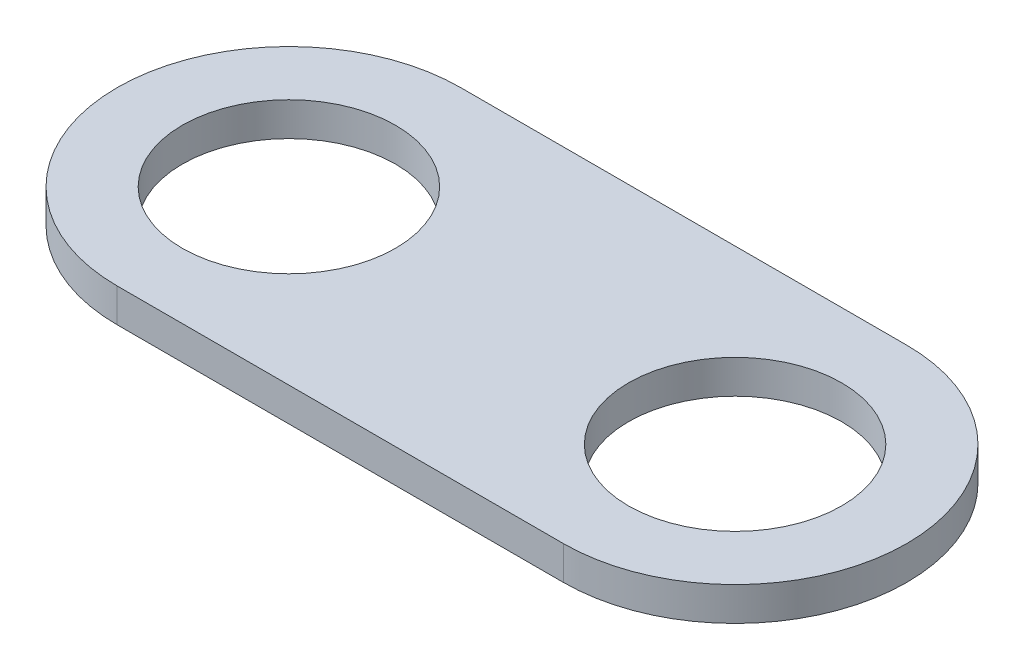
ISO-10303-21;
HEADER;
FILE_DESCRIPTION(('STEP AP214'),'2;1');
FILE_NAME('part.step','',(''),(''),'','','');
FILE_SCHEMA(('AUTOMOTIVE_DESIGN { 1 0 10303 214 1 1 1 1 }'));
ENDSEC;
DATA;
#1=APPLICATION_CONTEXT('core data for automotive mechanical design processes');
#2=APPLICATION_PROTOCOL_DEFINITION('international standard','automotive_design',2000,#1);
#3=PRODUCT_CONTEXT('',#1,'mechanical');
#4=PRODUCT('Part','Part','',(#3));
#5=PRODUCT_RELATED_PRODUCT_CATEGORY('part','',(#4));
#6=PRODUCT_DEFINITION_FORMATION('','',#4);
#7=PRODUCT_DEFINITION_CONTEXT('part definition',#1,'design');
#8=PRODUCT_DEFINITION('design','',#6,#7);
#9=PRODUCT_DEFINITION_SHAPE('','',#8);
#10=(LENGTH_UNIT() NAMED_UNIT(*) SI_UNIT(.MILLI.,.METRE.));
#11=(NAMED_UNIT(*) PLANE_ANGLE_UNIT() SI_UNIT($,.RADIAN.));
#12=(NAMED_UNIT(*) SI_UNIT($,.STERADIAN.) SOLID_ANGLE_UNIT());
#13=UNCERTAINTY_MEASURE_WITH_UNIT(LENGTH_MEASURE(1.E-05),#10,'distance_accuracy_value','');
#14=(GEOMETRIC_REPRESENTATION_CONTEXT(3) GLOBAL_UNCERTAINTY_ASSIGNED_CONTEXT((#13)) GLOBAL_UNIT_ASSIGNED_CONTEXT((#10,
#11,#12)) REPRESENTATION_CONTEXT('',''));
#15=CARTESIAN_POINT('',(0.,0.,0.));
#16=DIRECTION('',(0.,0.,1.));
#17=DIRECTION('',(1.,0.,0.));
#18=AXIS2_PLACEMENT_3D('',#15,#16,#17);
#19=CARTESIAN_POINT('',(-19.879152095,3.,15.30530954));
#20=DIRECTION('',(0.,-1.,0.));
#21=DIRECTION('',(0.,0.,-1.));
#22=AXIS2_PLACEMENT_3D('',#19,#20,#21);
#23=CYLINDRICAL_SURFACE('',#22,15.30530954);
#24=CARTESIAN_POINT('',(-19.879152095,0.,15.30530954));
#25=DIRECTION('',(0.,1.,0.));
#26=DIRECTION('',(0.,0.,1.));
#27=AXIS2_PLACEMENT_3D('',#24,#25,#26);
#28=CIRCLE('',#27,15.30530954);
#29=CARTESIAN_POINT('',(-19.879152095,0.,0.));
#30=VERTEX_POINT('',#29);
#31=CARTESIAN_POINT('',(-19.879152095,0.,30.61061908));
#32=VERTEX_POINT('',#31);
#33=EDGE_CURVE('E107',#30,#32,#28,.T.);
#34=ORIENTED_EDGE('',*,*,#33,.T.);
#35=DIRECTION('',(0.,-1.,0.));
#36=VECTOR('',#35,1.);
#37=CARTESIAN_POINT('',(-19.879152095,3.,30.61061908));
#38=LINE('',#37,#36);
#39=CARTESIAN_POINT('',(-19.879152095,3.,30.61061908));
#40=VERTEX_POINT('',#39);
#41=EDGE_CURVE('E11',#40,#32,#38,.T.);
#42=ORIENTED_EDGE('',*,*,#41,.F.);
#43=CARTESIAN_POINT('',(-19.879152095,3.,15.30530954));
#44=DIRECTION('',(0.,1.,0.));
#45=DIRECTION('',(0.,0.,1.));
#46=AXIS2_PLACEMENT_3D('',#43,#44,#45);
#47=CIRCLE('',#46,15.30530954);
#48=CARTESIAN_POINT('',(-19.879152095,3.,0.));
#49=VERTEX_POINT('',#48);
#50=EDGE_CURVE('E91',#49,#40,#47,.T.);
#51=ORIENTED_EDGE('',*,*,#50,.F.);
#52=DIRECTION('',(0.,-1.,0.));
#53=VECTOR('',#52,1.);
#54=CARTESIAN_POINT('',(-19.879152095,3.,0.));
#55=LINE('',#54,#53);
#56=EDGE_CURVE('E103',#49,#30,#55,.T.);
#57=ORIENTED_EDGE('',*,*,#56,.T.);
#58=EDGE_LOOP('',(#34,#42,#51,#57));
#59=FACE_BOUND('',#58,.T.);
#60=ADVANCED_FACE('F39',(#59),#23,.T.);
#61=CARTESIAN_POINT('',(-19.879152095,3.,30.61061908));
#62=DIRECTION('',(0.,0.,-1.));
#63=DIRECTION('',(-1.,0.,0.));
#64=AXIS2_PLACEMENT_3D('',#61,#62,#63);
#65=PLANE('',#64);
#66=DIRECTION('',(1.,0.,0.));
#67=VECTOR('',#66,1.);
#68=CARTESIAN_POINT('',(-19.879152095,0.,30.61061908));
#69=LINE('',#68,#67);
#70=CARTESIAN_POINT('',(19.879152095,0.,30.61061908));
#71=VERTEX_POINT('',#70);
#72=EDGE_CURVE('E96',#32,#71,#69,.T.);
#73=ORIENTED_EDGE('',*,*,#72,.T.);
#74=DIRECTION('',(0.,-1.,0.));
#75=VECTOR('',#74,1.);
#76=CARTESIAN_POINT('',(19.879152095,3.,30.61061908));
#77=LINE('',#76,#75);
#78=CARTESIAN_POINT('',(19.879152095,3.,30.61061908));
#79=VERTEX_POINT('',#78);
#80=EDGE_CURVE('E48',#79,#71,#77,.T.);
#81=ORIENTED_EDGE('',*,*,#80,.F.);
#82=DIRECTION('',(1.,0.,0.));
#83=VECTOR('',#82,1.);
#84=CARTESIAN_POINT('',(-19.879152095,3.,30.61061908));
#85=LINE('',#84,#83);
#86=EDGE_CURVE('E86',#40,#79,#85,.T.);
#87=ORIENTED_EDGE('',*,*,#86,.F.);
#88=ORIENTED_EDGE('',*,*,#41,.T.);
#89=EDGE_LOOP('',(#73,#81,#87,#88));
#90=FACE_BOUND('',#89,.T.);
#91=ADVANCED_FACE('F95',(#90),#65,.F.);
#92=CARTESIAN_POINT('',(19.879152095,3.,15.30530954));
#93=DIRECTION('',(0.,-1.,0.));
#94=DIRECTION('',(0.,0.,-1.));
#95=AXIS2_PLACEMENT_3D('',#92,#93,#94);
#96=CYLINDRICAL_SURFACE('',#95,15.30530954);
#97=CARTESIAN_POINT('',(19.879152095,0.,15.30530954));
#98=DIRECTION('',(0.,1.,0.));
#99=DIRECTION('',(0.,0.,1.));
#100=AXIS2_PLACEMENT_3D('',#97,#98,#99);
#101=CIRCLE('',#100,15.30530954);
#102=CARTESIAN_POINT('',(19.879152095,0.,0.));
#103=VERTEX_POINT('',#102);
#104=EDGE_CURVE('E73',#71,#103,#101,.T.);
#105=ORIENTED_EDGE('',*,*,#104,.T.);
#106=DIRECTION('',(0.,-1.,0.));
#107=VECTOR('',#106,1.);
#108=CARTESIAN_POINT('',(19.879152095,3.,0.));
#109=LINE('',#108,#107);
#110=CARTESIAN_POINT('',(19.879152095,3.,0.));
#111=VERTEX_POINT('',#110);
#112=EDGE_CURVE('E98',#111,#103,#109,.T.);
#113=ORIENTED_EDGE('',*,*,#112,.F.);
#114=CARTESIAN_POINT('',(19.879152095,3.,15.30530954));
#115=DIRECTION('',(0.,1.,0.));
#116=DIRECTION('',(0.,0.,1.));
#117=AXIS2_PLACEMENT_3D('',#114,#115,#116);
#118=CIRCLE('',#117,15.30530954);
#119=EDGE_CURVE('E89',#79,#111,#118,.T.);
#120=ORIENTED_EDGE('',*,*,#119,.F.);
#121=ORIENTED_EDGE('',*,*,#80,.T.);
#122=EDGE_LOOP('',(#105,#113,#120,#121));
#123=FACE_BOUND('',#122,.T.);
#124=ADVANCED_FACE('F99',(#123),#96,.T.);
#125=CARTESIAN_POINT('',(19.879152095,3.,0.));
#126=DIRECTION('',(0.,0.,1.));
#127=DIRECTION('',(1.,0.,0.));
#128=AXIS2_PLACEMENT_3D('',#125,#126,#127);
#129=PLANE('',#128);
#130=DIRECTION('',(-1.,0.,0.));
#131=VECTOR('',#130,1.);
#132=CARTESIAN_POINT('',(19.879152095,0.,0.));
#133=LINE('',#132,#131);
#134=EDGE_CURVE('E79',#103,#30,#133,.T.);
#135=ORIENTED_EDGE('',*,*,#134,.T.);
#136=ORIENTED_EDGE('',*,*,#56,.F.);
#137=DIRECTION('',(-1.,0.,0.));
#138=VECTOR('',#137,1.);
#139=CARTESIAN_POINT('',(19.879152095,3.,0.));
#140=LINE('',#139,#138);
#141=EDGE_CURVE('E56',#111,#49,#140,.T.);
#142=ORIENTED_EDGE('',*,*,#141,.F.);
#143=ORIENTED_EDGE('',*,*,#112,.T.);
#144=EDGE_LOOP('',(#135,#136,#142,#143));
#145=FACE_BOUND('',#144,.T.);
#146=ADVANCED_FACE('F121',(#145),#129,.F.);
#147=CARTESIAN_POINT('',(-19.879152095,3.,15.30530954));
#148=DIRECTION('',(0.,1.,0.));
#149=DIRECTION('',(0.,0.,1.));
#150=AXIS2_PLACEMENT_3D('',#147,#148,#149);
#151=PLANE('',#150);
#152=CARTESIAN_POINT('',(-19.879152095,3.,15.30530954));
#153=DIRECTION('',(0.,1.,0.));
#154=DIRECTION('',(0.,0.,1.));
#155=AXIS2_PLACEMENT_3D('',#152,#153,#154);
#156=CIRCLE('',#155,9.5);
#157=CARTESIAN_POINT('',(-19.879152095,3.,24.80530954));
#158=VERTEX_POINT('',#157);
#159=EDGE_CURVE('E136',#158,#158,#156,.T.);
#160=ORIENTED_EDGE('',*,*,#159,.F.);
#161=EDGE_LOOP('',(#160));
#162=FACE_BOUND('',#161,.T.);
#163=CARTESIAN_POINT('',(19.879152095,3.,15.30530954));
#164=DIRECTION('',(0.,1.,0.));
#165=DIRECTION('',(0.,0.,-1.));
#166=AXIS2_PLACEMENT_3D('',#163,#164,#165);
#167=CIRCLE('',#166,9.5);
#168=CARTESIAN_POINT('',(19.879152095,3.,5.80530954));
#169=VERTEX_POINT('',#168);
#170=EDGE_CURVE('E128',#169,#169,#167,.T.);
#171=ORIENTED_EDGE('',*,*,#170,.F.);
#172=EDGE_LOOP('',(#171));
#173=FACE_BOUND('',#172,.T.);
#174=ORIENTED_EDGE('',*,*,#50,.T.);
#175=ORIENTED_EDGE('',*,*,#86,.T.);
#176=ORIENTED_EDGE('',*,*,#119,.T.);
#177=ORIENTED_EDGE('',*,*,#141,.T.);
#178=EDGE_LOOP('',(#174,#175,#176,#177));
#179=FACE_BOUND('',#178,.T.);
#180=ADVANCED_FACE('F87',(#162,#173,#179),#151,.T.);
#181=CARTESIAN_POINT('',(-19.879152095,0.,15.30530954));
#182=DIRECTION('',(0.,1.,0.));
#183=DIRECTION('',(0.,0.,1.));
#184=AXIS2_PLACEMENT_3D('',#181,#182,#183);
#185=PLANE('',#184);
#186=CARTESIAN_POINT('',(-19.879152095,0.,15.30530954));
#187=DIRECTION('',(0.,1.,0.));
#188=DIRECTION('',(0.,0.,1.));
#189=AXIS2_PLACEMENT_3D('',#186,#187,#188);
#190=CIRCLE('',#189,9.5);
#191=CARTESIAN_POINT('',(-19.879152095,0.,24.80530954));
#192=VERTEX_POINT('',#191);
#193=EDGE_CURVE('E111',#192,#192,#190,.T.);
#194=ORIENTED_EDGE('',*,*,#193,.T.);
#195=EDGE_LOOP('',(#194));
#196=FACE_BOUND('',#195,.T.);
#197=CARTESIAN_POINT('',(19.879152095,0.,15.30530954));
#198=DIRECTION('',(0.,1.,0.));
#199=DIRECTION('',(0.,0.,-1.));
#200=AXIS2_PLACEMENT_3D('',#197,#198,#199);
#201=CIRCLE('',#200,9.5);
#202=CARTESIAN_POINT('',(19.879152095,0.,5.80530954));
#203=VERTEX_POINT('',#202);
#204=EDGE_CURVE('E132',#203,#203,#201,.T.);
#205=ORIENTED_EDGE('',*,*,#204,.T.);
#206=EDGE_LOOP('',(#205));
#207=FACE_BOUND('',#206,.T.);
#208=ORIENTED_EDGE('',*,*,#33,.F.);
#209=ORIENTED_EDGE('',*,*,#134,.F.);
#210=ORIENTED_EDGE('',*,*,#104,.F.);
#211=ORIENTED_EDGE('',*,*,#72,.F.);
#212=EDGE_LOOP('',(#208,#209,#210,#211));
#213=FACE_BOUND('',#212,.T.);
#214=ADVANCED_FACE('F124',(#196,#207,#213),#185,.F.);
#215=CARTESIAN_POINT('',(19.879152095,0.,15.30530954));
#216=DIRECTION('',(0.,1.,0.));
#217=DIRECTION('',(0.,0.,1.));
#218=AXIS2_PLACEMENT_3D('',#215,#216,#217);
#219=CYLINDRICAL_SURFACE('',#218,9.5);
#220=ORIENTED_EDGE('',*,*,#204,.F.);
#221=EDGE_LOOP('',(#220));
#222=FACE_BOUND('',#221,.T.);
#223=ORIENTED_EDGE('',*,*,#170,.T.);
#224=EDGE_LOOP('',(#223));
#225=FACE_BOUND('',#224,.T.);
#226=ADVANCED_FACE('F149',(#222,#225),#219,.F.);
#227=CARTESIAN_POINT('',(-19.879152095,0.,15.30530954));
#228=DIRECTION('',(0.,1.,0.));
#229=DIRECTION('',(0.,0.,1.));
#230=AXIS2_PLACEMENT_3D('',#227,#228,#229);
#231=CYLINDRICAL_SURFACE('',#230,9.5);
#232=ORIENTED_EDGE('',*,*,#193,.F.);
#233=EDGE_LOOP('',(#232));
#234=FACE_BOUND('',#233,.T.);
#235=ORIENTED_EDGE('',*,*,#159,.T.);
#236=EDGE_LOOP('',(#235));
#237=FACE_BOUND('',#236,.T.);
#238=ADVANCED_FACE('F146',(#234,#237),#231,.F.);
#239=CLOSED_SHELL('',(#60,#91,#124,#146,#180,#214,#226,#238));
#240=MANIFOLD_SOLID_BREP('B2',#239);
#241=ADVANCED_BREP_SHAPE_REPRESENTATION('',(#18,#240),#14);
#242=SHAPE_DEFINITION_REPRESENTATION(#9,#241);
ENDSEC;
END-ISO-10303-21;
